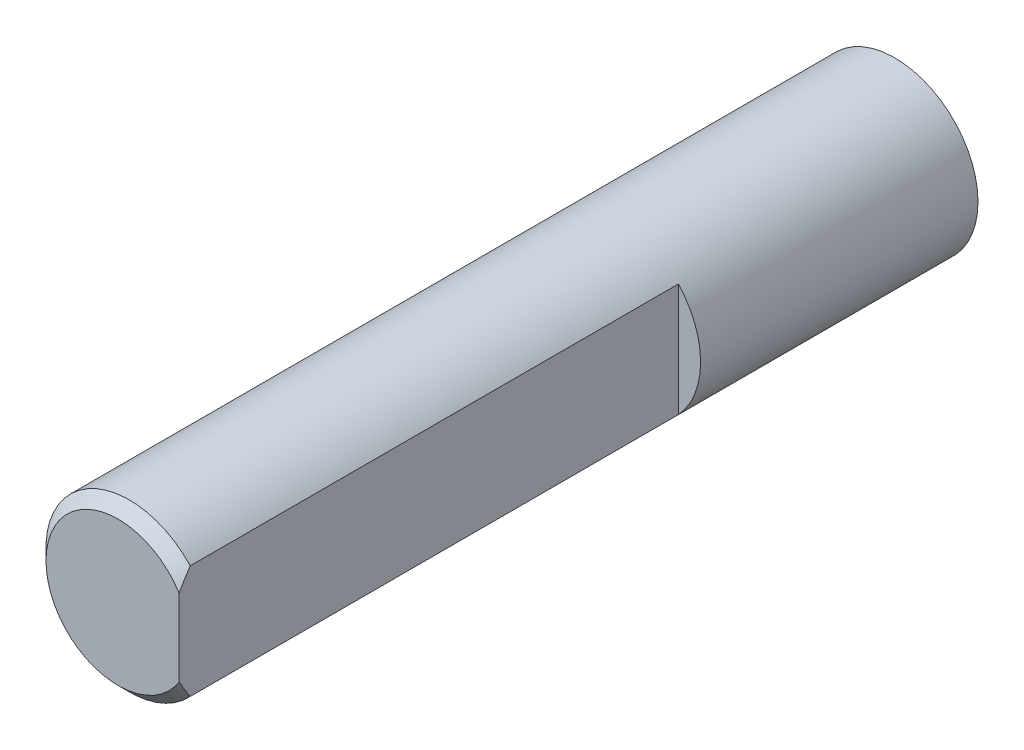
ISO-10303-21;
HEADER;
FILE_DESCRIPTION(('STEP AP214'),'2;1');
FILE_NAME('part.step','',(''),(''),'','','');
FILE_SCHEMA(('AUTOMOTIVE_DESIGN { 1 0 10303 214 1 1 1 1 }'));
ENDSEC;
DATA;
#1=APPLICATION_CONTEXT('core data for automotive mechanical design processes');
#2=APPLICATION_PROTOCOL_DEFINITION('international standard','automotive_design',2000,#1);
#3=PRODUCT_CONTEXT('',#1,'mechanical');
#4=PRODUCT('Part','Part','',(#3));
#5=PRODUCT_RELATED_PRODUCT_CATEGORY('part','',(#4));
#6=PRODUCT_DEFINITION_FORMATION('','',#4);
#7=PRODUCT_DEFINITION_CONTEXT('part definition',#1,'design');
#8=PRODUCT_DEFINITION('design','',#6,#7);
#9=PRODUCT_DEFINITION_SHAPE('','',#8);
#10=(LENGTH_UNIT() NAMED_UNIT(*) SI_UNIT(.MILLI.,.METRE.));
#11=(NAMED_UNIT(*) PLANE_ANGLE_UNIT() SI_UNIT($,.RADIAN.));
#12=(NAMED_UNIT(*) SI_UNIT($,.STERADIAN.) SOLID_ANGLE_UNIT());
#13=UNCERTAINTY_MEASURE_WITH_UNIT(LENGTH_MEASURE(1.E-05),#10,'distance_accuracy_value','');
#14=(GEOMETRIC_REPRESENTATION_CONTEXT(3) GLOBAL_UNCERTAINTY_ASSIGNED_CONTEXT((#13)) GLOBAL_UNIT_ASSIGNED_CONTEXT((#10,
#11,#12)) REPRESENTATION_CONTEXT('',''));
#15=CARTESIAN_POINT('',(0.,0.,0.));
#16=DIRECTION('',(0.,0.,1.));
#17=DIRECTION('',(1.,0.,0.));
#18=AXIS2_PLACEMENT_3D('',#15,#16,#17);
#19=CARTESIAN_POINT('',(0.,0.,5.00000000000002));
#20=DIRECTION('',(0.,0.,-0.999999999999998));
#21=DIRECTION('',(-0.999999999999999,0.,0.));
#22=AXIS2_PLACEMENT_3D('',#19,#20,#21);
#23=CYLINDRICAL_SURFACE('',#22,1.5);
#24=DIRECTION('',(0.,0.,-0.999999999999998));
#25=VECTOR('',#24,1.);
#26=CARTESIAN_POINT('',(1.1,-1.01980390271855,14.));
#27=LINE('',#26,#25);
#28=CARTESIAN_POINT('',(1.1,-1.01980390271855,13.8));
#29=VERTEX_POINT('',#28);
#30=CARTESIAN_POINT('',(1.09999999999999,-1.01980390271857,4.99999999999998));
#31=VERTEX_POINT('',#30);
#32=EDGE_CURVE('E76',#29,#31,#27,.T.);
#33=ORIENTED_EDGE('',*,*,#32,.F.);
#34=CARTESIAN_POINT('',(0.,0.,13.8));
#35=DIRECTION('',(0.,0.,0.999999999999998));
#36=DIRECTION('',(0.999999999999999,0.,0.));
#37=AXIS2_PLACEMENT_3D('',#34,#35,#36);
#38=CIRCLE('',#37,1.5);
#39=CARTESIAN_POINT('',(1.09999999999998,1.01980390271855,13.7999999999999));
#40=VERTEX_POINT('',#39);
#41=EDGE_CURVE('E11',#29,#40,#38,.F.);
#42=ORIENTED_EDGE('',*,*,#41,.T.);
#43=DIRECTION('',(0.,0.,-0.999999999999998));
#44=VECTOR('',#43,1.);
#45=CARTESIAN_POINT('',(1.09999999999998,1.01980390271853,14.));
#46=LINE('',#45,#44);
#47=CARTESIAN_POINT('',(1.09999999999999,1.01980390271855,5.00000000000002));
#48=VERTEX_POINT('',#47);
#49=EDGE_CURVE('E70',#40,#48,#46,.T.);
#50=ORIENTED_EDGE('',*,*,#49,.T.);
#51=CARTESIAN_POINT('',(0.,0.,5.00000000000002));
#52=DIRECTION('',(0.,0.,0.999999999999998));
#53=DIRECTION('',(0.999999999999999,0.,0.));
#54=AXIS2_PLACEMENT_3D('',#51,#52,#53);
#55=CIRCLE('',#54,1.5);
#56=EDGE_CURVE('E73',#31,#48,#55,.T.);
#57=ORIENTED_EDGE('',*,*,#56,.F.);
#58=EDGE_LOOP('',(#33,#42,#50,#57));
#59=FACE_BOUND('',#58,.T.);
#60=CARTESIAN_POINT('',(0.,0.,0.));
#61=DIRECTION('',(0.,0.,0.999999999999998));
#62=DIRECTION('',(0.999999999999999,0.,0.));
#63=AXIS2_PLACEMENT_3D('',#60,#61,#62);
#64=CIRCLE('',#63,1.5);
#65=CARTESIAN_POINT('',(1.5,0.,0.));
#66=VERTEX_POINT('',#65);
#67=EDGE_CURVE('E84',#66,#66,#64,.T.);
#68=ORIENTED_EDGE('',*,*,#67,.T.);
#69=EDGE_LOOP('',(#68));
#70=FACE_BOUND('',#69,.T.);
#71=ADVANCED_FACE('F39',(#59,#70),#23,.T.);
#72=CARTESIAN_POINT('',(0.,0.,5.00000000000002));
#73=DIRECTION('',(0.,0.,0.999999999999998));
#74=DIRECTION('',(0.999999999999999,0.,0.));
#75=AXIS2_PLACEMENT_3D('',#72,#73,#74);
#76=PLANE('',#75);
#77=DIRECTION('',(0.,1.,0.));
#78=VECTOR('',#77,1.);
#79=CARTESIAN_POINT('',(1.09999999999999,1.01980390271855,5.00000000000002));
#80=LINE('',#79,#78);
#81=EDGE_CURVE('E82',#31,#48,#80,.T.);
#82=ORIENTED_EDGE('',*,*,#81,.F.);
#83=ORIENTED_EDGE('',*,*,#56,.T.);
#84=EDGE_LOOP('',(#82,#83));
#85=FACE_BOUND('',#84,.T.);
#86=ADVANCED_FACE('F81',(#85),#76,.T.);
#87=CARTESIAN_POINT('',(0.,0.,0.));
#88=DIRECTION('',(0.,0.,0.999999999999998));
#89=DIRECTION('',(0.999999999999999,0.,0.));
#90=AXIS2_PLACEMENT_3D('',#87,#88,#89);
#91=PLANE('',#90);
#92=ORIENTED_EDGE('',*,*,#67,.F.);
#93=EDGE_LOOP('',(#92));
#94=FACE_BOUND('',#93,.T.);
#95=ADVANCED_FACE('F111',(#94),#91,.F.);
#96=CARTESIAN_POINT('',(1.09999999999998,1.01980390271853,14.));
#97=DIRECTION('',(-0.999999999999999,0.,0.));
#98=DIRECTION('',(0.,0.,0.999999999999998));
#99=AXIS2_PLACEMENT_3D('',#96,#97,#98);
#100=PLANE('',#99);
#101=DIRECTION('',(0.,1.,0.));
#102=VECTOR('',#101,1.);
#103=CARTESIAN_POINT('',(1.09999999999998,1.01980390271853,14.));
#104=LINE('',#103,#102);
#105=CARTESIAN_POINT('',(1.10000000000001,-0.692820323027553,14.));
#106=VERTEX_POINT('',#105);
#107=CARTESIAN_POINT('',(1.09999999999998,0.692820323027546,13.9999999999999));
#108=VERTEX_POINT('',#107);
#109=EDGE_CURVE('E77',#106,#108,#104,.T.);
#110=ORIENTED_EDGE('',*,*,#109,.F.);
#111=CARTESIAN_POINT('',(1.10000000000001,-0.692820323027553,14.));
#112=CARTESIAN_POINT('',(1.09999999999999,-0.721034999498848,13.9849579511195));
#113=CARTESIAN_POINT('',(1.09999999999999,-0.748976501374792,13.9694145830815));
#114=CARTESIAN_POINT('',(1.09999999999998,-0.804345871055822,13.9374811861867));
#115=CARTESIAN_POINT('',(1.09999999999998,-0.831774089884483,13.9210917670804));
#116=CARTESIAN_POINT('',(1.09999999999998,-0.886185309848164,13.8876030724258));
#117=CARTESIAN_POINT('',(1.09999999999998,-0.913168380107202,13.8705039085668));
#118=CARTESIAN_POINT('',(1.09999999999998,-0.966760182783561,13.8356869399405));
#119=CARTESIAN_POINT('',(1.09999999999999,-0.993368635698554,13.8179687043847));
#120=CARTESIAN_POINT('',(1.1,-1.01980390271855,13.8));
#121=B_SPLINE_CURVE_WITH_KNOTS('',3,(#111,#112,#113,#114,#115,#116,#117,#118,#119,#120),
.UNSPECIFIED.,.F.,.F.,(4,2,2,2,4),(0.,0.0959091715045936,0.191750160742859,0.287576124695524,
0.383470153016525),.UNSPECIFIED.);
#122=EDGE_CURVE('E48',#106,#29,#121,.T.);
#123=ORIENTED_EDGE('',*,*,#122,.T.);
#124=ORIENTED_EDGE('',*,*,#32,.T.);
#125=ORIENTED_EDGE('',*,*,#81,.T.);
#126=ORIENTED_EDGE('',*,*,#49,.F.);
#127=CARTESIAN_POINT('',(1.09999999999998,1.01980390271855,13.7999999999999));
#128=CARTESIAN_POINT('',(1.09999999999998,0.993368635698558,13.8179687043847));
#129=CARTESIAN_POINT('',(1.09999999999998,0.966760182783568,13.8356869399405));
#130=CARTESIAN_POINT('',(1.09999999999998,0.913168380107212,13.8705039085668));
#131=CARTESIAN_POINT('',(1.09999999999998,0.886185309848173,13.8876030724258));
#132=CARTESIAN_POINT('',(1.09999999999998,0.831774089884492,13.9210917670804));
#133=CARTESIAN_POINT('',(1.09999999999998,0.804345871055833,13.9374811861867));
#134=CARTESIAN_POINT('',(1.09999999999998,0.748976501374801,13.9694145830815));
#135=CARTESIAN_POINT('',(1.09999999999998,0.721034999498853,13.9849579511195));
#136=CARTESIAN_POINT('',(1.09999999999998,0.692820323027546,13.9999999999999));
#137=B_SPLINE_CURVE_WITH_KNOTS('',3,(#127,#128,#129,#130,#131,#132,#133,#134,#135,#136),
.UNSPECIFIED.,.F.,.F.,(4,2,2,2,4),(0.,0.0958940283210038,0.191719992273667,0.287560981511932,
0.383470153016527),.UNSPECIFIED.);
#138=EDGE_CURVE('E96',#40,#108,#137,.T.);
#139=ORIENTED_EDGE('',*,*,#138,.T.);
#140=EDGE_LOOP('',(#110,#123,#124,#125,#126,#139));
#141=FACE_BOUND('',#140,.T.);
#142=ADVANCED_FACE('F86',(#141),#100,.F.);
#143=CARTESIAN_POINT('',(0.,0.,14.));
#144=DIRECTION('',(0.,0.,0.999999999999998));
#145=DIRECTION('',(0.999999999999999,0.,0.));
#146=AXIS2_PLACEMENT_3D('',#143,#144,#145);
#147=PLANE('',#146);
#148=ORIENTED_EDGE('',*,*,#109,.T.);
#149=CARTESIAN_POINT('',(0.,0.,14.));
#150=DIRECTION('',(0.,0.,0.999999999999998));
#151=DIRECTION('',(0.999999999999999,0.,0.));
#152=AXIS2_PLACEMENT_3D('',#149,#150,#151);
#153=CIRCLE('',#152,1.3);
#154=EDGE_CURVE('E83',#108,#106,#153,.T.);
#155=ORIENTED_EDGE('',*,*,#154,.T.);
#156=EDGE_LOOP('',(#148,#155));
#157=FACE_BOUND('',#156,.T.);
#158=ADVANCED_FACE('F110',(#157),#147,.T.);
#159=CARTESIAN_POINT('',(0.,0.,14.));
#160=DIRECTION('',(0.,0.,-0.999999999999998));
#161=DIRECTION('',(-0.999999999999999,0.,0.));
#162=AXIS2_PLACEMENT_3D('',#159,#160,#161);
#163=CONICAL_SURFACE('',#162,1.3,0.785398163397449);
#164=ORIENTED_EDGE('',*,*,#138,.F.);
#165=ORIENTED_EDGE('',*,*,#41,.F.);
#166=ORIENTED_EDGE('',*,*,#122,.F.);
#167=ORIENTED_EDGE('',*,*,#154,.F.);
#168=EDGE_LOOP('',(#164,#165,#166,#167));
#169=FACE_BOUND('',#168,.T.);
#170=ADVANCED_FACE('F41',(#169),#163,.T.);
#171=CLOSED_SHELL('',(#71,#86,#95,#142,#158,#170));
#172=MANIFOLD_SOLID_BREP('B2',#171);
#173=ADVANCED_BREP_SHAPE_REPRESENTATION('',(#18,#172),#14);
#174=SHAPE_DEFINITION_REPRESENTATION(#9,#173);
ENDSEC;
END-ISO-10303-21;
